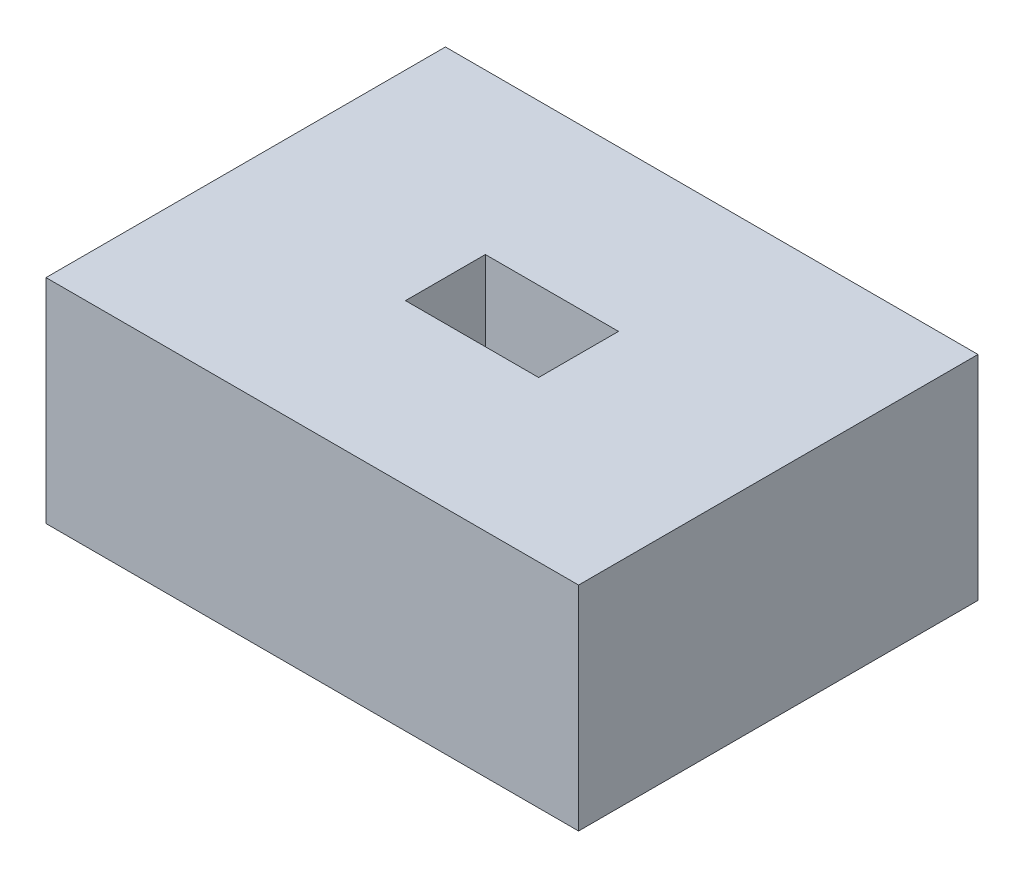
ISO-10303-21;
HEADER;
FILE_DESCRIPTION(('STEP AP214'),'2;1');
FILE_NAME('part.step','',(''),(''),'','','');
FILE_SCHEMA(('AUTOMOTIVE_DESIGN { 1 0 10303 214 1 1 1 1 }'));
ENDSEC;
DATA;
#1=APPLICATION_CONTEXT('core data for automotive mechanical design processes');
#2=APPLICATION_PROTOCOL_DEFINITION('international standard','automotive_design',2000,#1);
#3=PRODUCT_CONTEXT('',#1,'mechanical');
#4=PRODUCT('Part','Part','',(#3));
#5=PRODUCT_RELATED_PRODUCT_CATEGORY('part','',(#4));
#6=PRODUCT_DEFINITION_FORMATION('','',#4);
#7=PRODUCT_DEFINITION_CONTEXT('part definition',#1,'design');
#8=PRODUCT_DEFINITION('design','',#6,#7);
#9=PRODUCT_DEFINITION_SHAPE('','',#8);
#10=(LENGTH_UNIT() NAMED_UNIT(*) SI_UNIT(.MILLI.,.METRE.));
#11=(NAMED_UNIT(*) PLANE_ANGLE_UNIT() SI_UNIT($,.RADIAN.));
#12=(NAMED_UNIT(*) SI_UNIT($,.STERADIAN.) SOLID_ANGLE_UNIT());
#13=UNCERTAINTY_MEASURE_WITH_UNIT(LENGTH_MEASURE(1.E-05),#10,'distance_accuracy_value','');
#14=(GEOMETRIC_REPRESENTATION_CONTEXT(3) GLOBAL_UNCERTAINTY_ASSIGNED_CONTEXT((#13)) GLOBAL_UNIT_ASSIGNED_CONTEXT((#10,
#11,#12)) REPRESENTATION_CONTEXT('',''));
#15=CARTESIAN_POINT('',(0.,0.,0.));
#16=DIRECTION('',(0.,0.,1.));
#17=DIRECTION('',(1.,0.,0.));
#18=AXIS2_PLACEMENT_3D('',#15,#16,#17);
#19=CARTESIAN_POINT('',(10.,8.,7.5));
#20=DIRECTION('',(-1.,0.,0.));
#21=DIRECTION('',(0.,0.,1.));
#22=AXIS2_PLACEMENT_3D('',#19,#20,#21);
#23=PLANE('',#22);
#24=DIRECTION('',(0.,0.,-1.));
#25=VECTOR('',#24,1.);
#26=CARTESIAN_POINT('',(10.,0.,7.5));
#27=LINE('',#26,#25);
#28=CARTESIAN_POINT('',(10.,0.,7.5));
#29=VERTEX_POINT('',#28);
#30=CARTESIAN_POINT('',(10.,0.,-7.5));
#31=VERTEX_POINT('',#30);
#32=EDGE_CURVE('E172',#29,#31,#27,.T.);
#33=ORIENTED_EDGE('',*,*,#32,.T.);
#34=DIRECTION('',(0.,-1.,0.));
#35=VECTOR('',#34,1.);
#36=CARTESIAN_POINT('',(10.,8.,-7.5));
#37=LINE('',#36,#35);
#38=CARTESIAN_POINT('',(10.,8.,-7.5));
#39=VERTEX_POINT('',#38);
#40=EDGE_CURVE('E11',#39,#31,#37,.T.);
#41=ORIENTED_EDGE('',*,*,#40,.F.);
#42=DIRECTION('',(0.,0.,-1.));
#43=VECTOR('',#42,1.);
#44=CARTESIAN_POINT('',(10.,8.,7.5));
#45=LINE('',#44,#43);
#46=CARTESIAN_POINT('',(10.,8.,7.5));
#47=VERTEX_POINT('',#46);
#48=EDGE_CURVE('E179',#47,#39,#45,.T.);
#49=ORIENTED_EDGE('',*,*,#48,.F.);
#50=DIRECTION('',(0.,-1.,0.));
#51=VECTOR('',#50,1.);
#52=CARTESIAN_POINT('',(10.,8.,7.5));
#53=LINE('',#52,#51);
#54=EDGE_CURVE('E189',#47,#29,#53,.T.);
#55=ORIENTED_EDGE('',*,*,#54,.T.);
#56=EDGE_LOOP('',(#33,#41,#49,#55));
#57=FACE_BOUND('',#56,.T.);
#58=ADVANCED_FACE('F33',(#57),#23,.F.);
#59=CARTESIAN_POINT('',(-10.,8.,-7.5));
#60=DIRECTION('',(0.,0.,1.));
#61=DIRECTION('',(1.,0.,0.));
#62=AXIS2_PLACEMENT_3D('',#59,#60,#61);
#63=PLANE('',#62);
#64=DIRECTION('',(-1.,0.,0.));
#65=VECTOR('',#64,1.);
#66=CARTESIAN_POINT('',(-10.,0.,-7.5));
#67=LINE('',#66,#65);
#68=CARTESIAN_POINT('',(-10.,0.,-7.5));
#69=VERTEX_POINT('',#68);
#70=EDGE_CURVE('E192',#31,#69,#67,.T.);
#71=ORIENTED_EDGE('',*,*,#70,.T.);
#72=DIRECTION('',(0.,-1.,0.));
#73=VECTOR('',#72,1.);
#74=CARTESIAN_POINT('',(-10.,8.,-7.5));
#75=LINE('',#74,#73);
#76=CARTESIAN_POINT('',(-10.,8.,-7.5));
#77=VERTEX_POINT('',#76);
#78=EDGE_CURVE('E40',#77,#69,#75,.T.);
#79=ORIENTED_EDGE('',*,*,#78,.F.);
#80=DIRECTION('',(-1.,0.,0.));
#81=VECTOR('',#80,1.);
#82=CARTESIAN_POINT('',(-10.,8.,-7.5));
#83=LINE('',#82,#81);
#84=EDGE_CURVE('E182',#39,#77,#83,.T.);
#85=ORIENTED_EDGE('',*,*,#84,.F.);
#86=ORIENTED_EDGE('',*,*,#40,.T.);
#87=EDGE_LOOP('',(#71,#79,#85,#86));
#88=FACE_BOUND('',#87,.T.);
#89=ADVANCED_FACE('F222',(#88),#63,.F.);
#90=CARTESIAN_POINT('',(-10.,8.,7.5));
#91=DIRECTION('',(1.,0.,0.));
#92=DIRECTION('',(0.,0.,-1.));
#93=AXIS2_PLACEMENT_3D('',#90,#91,#92);
#94=PLANE('',#93);
#95=DIRECTION('',(0.,0.,1.));
#96=VECTOR('',#95,1.);
#97=CARTESIAN_POINT('',(-10.,0.,7.5));
#98=LINE('',#97,#96);
#99=CARTESIAN_POINT('',(-10.,0.,7.5));
#100=VERTEX_POINT('',#99);
#101=EDGE_CURVE('E194',#69,#100,#98,.T.);
#102=ORIENTED_EDGE('',*,*,#101,.T.);
#103=DIRECTION('',(0.,-1.,0.));
#104=VECTOR('',#103,1.);
#105=CARTESIAN_POINT('',(-10.,8.,7.5));
#106=LINE('',#105,#104);
#107=CARTESIAN_POINT('',(-10.,8.,7.5));
#108=VERTEX_POINT('',#107);
#109=EDGE_CURVE('E199',#108,#100,#106,.T.);
#110=ORIENTED_EDGE('',*,*,#109,.F.);
#111=DIRECTION('',(0.,0.,1.));
#112=VECTOR('',#111,1.);
#113=CARTESIAN_POINT('',(-10.,8.,7.5));
#114=LINE('',#113,#112);
#115=EDGE_CURVE('E185',#77,#108,#114,.T.);
#116=ORIENTED_EDGE('',*,*,#115,.F.);
#117=ORIENTED_EDGE('',*,*,#78,.T.);
#118=EDGE_LOOP('',(#102,#110,#116,#117));
#119=FACE_BOUND('',#118,.T.);
#120=ADVANCED_FACE('F206',(#119),#94,.F.);
#121=CARTESIAN_POINT('',(-10.,8.,7.5));
#122=DIRECTION('',(0.,0.,-1.));
#123=DIRECTION('',(-1.,0.,0.));
#124=AXIS2_PLACEMENT_3D('',#121,#122,#123);
#125=PLANE('',#124);
#126=DIRECTION('',(1.,0.,0.));
#127=VECTOR('',#126,1.);
#128=CARTESIAN_POINT('',(-10.,0.,7.5));
#129=LINE('',#128,#127);
#130=EDGE_CURVE('E183',#100,#29,#129,.T.);
#131=ORIENTED_EDGE('',*,*,#130,.T.);
#132=ORIENTED_EDGE('',*,*,#54,.F.);
#133=DIRECTION('',(1.,0.,0.));
#134=VECTOR('',#133,1.);
#135=CARTESIAN_POINT('',(-10.,8.,7.5));
#136=LINE('',#135,#134);
#137=EDGE_CURVE('E187',#108,#47,#136,.T.);
#138=ORIENTED_EDGE('',*,*,#137,.F.);
#139=ORIENTED_EDGE('',*,*,#109,.T.);
#140=EDGE_LOOP('',(#131,#132,#138,#139));
#141=FACE_BOUND('',#140,.T.);
#142=ADVANCED_FACE('F215',(#141),#125,.F.);
#143=CARTESIAN_POINT('',(0.,8.,0.));
#144=DIRECTION('',(0.,-1.,0.));
#145=DIRECTION('',(0.,0.,-1.));
#146=AXIS2_PLACEMENT_3D('',#143,#144,#145);
#147=PLANE('',#146);
#148=DIRECTION('',(-1.,0.,0.));
#149=VECTOR('',#148,1.);
#150=CARTESIAN_POINT('',(-2.5,8.,-1.5));
#151=LINE('',#150,#149);
#152=CARTESIAN_POINT('',(2.5,8.,-1.5));
#153=VERTEX_POINT('',#152);
#154=CARTESIAN_POINT('',(-2.5,8.,-1.5));
#155=VERTEX_POINT('',#154);
#156=EDGE_CURVE('E143',#153,#155,#151,.T.);
#157=ORIENTED_EDGE('',*,*,#156,.F.);
#158=DIRECTION('',(0.,0.,-1.));
#159=VECTOR('',#158,1.);
#160=CARTESIAN_POINT('',(2.5,8.,1.5));
#161=LINE('',#160,#159);
#162=CARTESIAN_POINT('',(2.5,8.,1.5));
#163=VERTEX_POINT('',#162);
#164=EDGE_CURVE('E141',#163,#153,#161,.T.);
#165=ORIENTED_EDGE('',*,*,#164,.F.);
#166=DIRECTION('',(1.,0.,0.));
#167=VECTOR('',#166,1.);
#168=CARTESIAN_POINT('',(-2.5,8.,1.5));
#169=LINE('',#168,#167);
#170=CARTESIAN_POINT('',(-2.5,8.,1.5));
#171=VERTEX_POINT('',#170);
#172=EDGE_CURVE('E153',#171,#163,#169,.T.);
#173=ORIENTED_EDGE('',*,*,#172,.F.);
#174=DIRECTION('',(0.,0.,1.));
#175=VECTOR('',#174,1.);
#176=CARTESIAN_POINT('',(-2.5,8.,1.5));
#177=LINE('',#176,#175);
#178=EDGE_CURVE('E165',#155,#171,#177,.T.);
#179=ORIENTED_EDGE('',*,*,#178,.F.);
#180=EDGE_LOOP('',(#157,#165,#173,#179));
#181=FACE_BOUND('',#180,.T.);
#182=ORIENTED_EDGE('',*,*,#48,.T.);
#183=ORIENTED_EDGE('',*,*,#84,.T.);
#184=ORIENTED_EDGE('',*,*,#115,.T.);
#185=ORIENTED_EDGE('',*,*,#137,.T.);
#186=EDGE_LOOP('',(#182,#183,#184,#185));
#187=FACE_BOUND('',#186,.T.);
#188=ADVANCED_FACE('F221',(#181,#187),#147,.F.);
#189=CARTESIAN_POINT('',(0.,0.,0.));
#190=DIRECTION('',(0.,-1.,0.));
#191=DIRECTION('',(0.,0.,-1.));
#192=AXIS2_PLACEMENT_3D('',#189,#190,#191);
#193=PLANE('',#192);
#194=DIRECTION('',(-1.,0.,0.));
#195=VECTOR('',#194,1.);
#196=CARTESIAN_POINT('',(2.5,0.,1.5));
#197=LINE('',#196,#195);
#198=CARTESIAN_POINT('',(2.5,0.,1.5));
#199=VERTEX_POINT('',#198);
#200=CARTESIAN_POINT('',(-2.5,0.,1.5));
#201=VERTEX_POINT('',#200);
#202=EDGE_CURVE('E47',#199,#201,#197,.T.);
#203=ORIENTED_EDGE('',*,*,#202,.F.);
#204=DIRECTION('',(0.,0.,1.));
#205=VECTOR('',#204,1.);
#206=CARTESIAN_POINT('',(2.5,0.,-1.5));
#207=LINE('',#206,#205);
#208=CARTESIAN_POINT('',(2.5,0.,-1.5));
#209=VERTEX_POINT('',#208);
#210=EDGE_CURVE('E51',#209,#199,#207,.T.);
#211=ORIENTED_EDGE('',*,*,#210,.F.);
#212=DIRECTION('',(1.,0.,0.));
#213=VECTOR('',#212,1.);
#214=CARTESIAN_POINT('',(-2.5,0.,-1.5));
#215=LINE('',#214,#213);
#216=CARTESIAN_POINT('',(-2.5,0.,-1.5));
#217=VERTEX_POINT('',#216);
#218=EDGE_CURVE('E367',#217,#209,#215,.T.);
#219=ORIENTED_EDGE('',*,*,#218,.F.);
#220=DIRECTION('',(0.,0.,-1.));
#221=VECTOR('',#220,1.);
#222=CARTESIAN_POINT('',(-2.5,0.,1.5));
#223=LINE('',#222,#221);
#224=EDGE_CURVE('E373',#201,#217,#223,.T.);
#225=ORIENTED_EDGE('',*,*,#224,.F.);
#226=EDGE_LOOP('',(#203,#211,#219,#225));
#227=FACE_BOUND('',#226,.T.);
#228=ORIENTED_EDGE('',*,*,#32,.F.);
#229=ORIENTED_EDGE('',*,*,#130,.F.);
#230=ORIENTED_EDGE('',*,*,#101,.F.);
#231=ORIENTED_EDGE('',*,*,#70,.F.);
#232=EDGE_LOOP('',(#228,#229,#230,#231));
#233=FACE_BOUND('',#232,.T.);
#234=ADVANCED_FACE('F212',(#227,#233),#193,.T.);
#235=CARTESIAN_POINT('',(2.5,4.8,1.5));
#236=DIRECTION('',(1.,0.,0.));
#237=DIRECTION('',(0.,0.,-1.));
#238=AXIS2_PLACEMENT_3D('',#235,#236,#237);
#239=PLANE('',#238);
#240=ORIENTED_EDGE('',*,*,#164,.T.);
#241=DIRECTION('',(0.,1.,0.));
#242=VECTOR('',#241,1.);
#243=CARTESIAN_POINT('',(2.5,4.8,-1.5));
#244=LINE('',#243,#242);
#245=CARTESIAN_POINT('',(2.5,4.8,-1.5));
#246=VERTEX_POINT('',#245);
#247=EDGE_CURVE('E161',#246,#153,#244,.T.);
#248=ORIENTED_EDGE('',*,*,#247,.F.);
#249=DIRECTION('',(0.,0.,-1.));
#250=VECTOR('',#249,1.);
#251=CARTESIAN_POINT('',(2.5,4.8,1.5));
#252=LINE('',#251,#250);
#253=CARTESIAN_POINT('',(2.5,4.8,1.5));
#254=VERTEX_POINT('',#253);
#255=EDGE_CURVE('E149',#254,#246,#252,.T.);
#256=ORIENTED_EDGE('',*,*,#255,.F.);
#257=DIRECTION('',(0.,1.,0.));
#258=VECTOR('',#257,1.);
#259=CARTESIAN_POINT('',(2.5,4.8,1.5));
#260=LINE('',#259,#258);
#261=EDGE_CURVE('E170',#254,#163,#260,.T.);
#262=ORIENTED_EDGE('',*,*,#261,.T.);
#263=EDGE_LOOP('',(#240,#248,#256,#262));
#264=FACE_BOUND('',#263,.T.);
#265=ADVANCED_FACE('F234',(#264),#239,.F.);
#266=CARTESIAN_POINT('',(-2.5,4.8,1.5));
#267=DIRECTION('',(0.,0.,1.));
#268=DIRECTION('',(1.,0.,0.));
#269=AXIS2_PLACEMENT_3D('',#266,#267,#268);
#270=PLANE('',#269);
#271=ORIENTED_EDGE('',*,*,#172,.T.);
#272=ORIENTED_EDGE('',*,*,#261,.F.);
#273=DIRECTION('',(1.,0.,0.));
#274=VECTOR('',#273,1.);
#275=CARTESIAN_POINT('',(-2.5,4.8,1.5));
#276=LINE('',#275,#274);
#277=CARTESIAN_POINT('',(-2.5,4.8,1.5));
#278=VERTEX_POINT('',#277);
#279=EDGE_CURVE('E159',#278,#254,#276,.T.);
#280=ORIENTED_EDGE('',*,*,#279,.F.);
#281=DIRECTION('',(0.,1.,0.));
#282=VECTOR('',#281,1.);
#283=CARTESIAN_POINT('',(-2.5,4.8,1.5));
#284=LINE('',#283,#282);
#285=EDGE_CURVE('E173',#278,#171,#284,.T.);
#286=ORIENTED_EDGE('',*,*,#285,.T.);
#287=EDGE_LOOP('',(#271,#272,#280,#286));
#288=FACE_BOUND('',#287,.T.);
#289=ADVANCED_FACE('F240',(#288),#270,.F.);
#290=CARTESIAN_POINT('',(-2.5,4.8,1.5));
#291=DIRECTION('',(-1.,0.,0.));
#292=DIRECTION('',(0.,0.,1.));
#293=AXIS2_PLACEMENT_3D('',#290,#291,#292);
#294=PLANE('',#293);
#295=ORIENTED_EDGE('',*,*,#178,.T.);
#296=ORIENTED_EDGE('',*,*,#285,.F.);
#297=DIRECTION('',(0.,0.,1.));
#298=VECTOR('',#297,1.);
#299=CARTESIAN_POINT('',(-2.5,4.8,1.5));
#300=LINE('',#299,#298);
#301=CARTESIAN_POINT('',(-2.5,4.8,-1.5));
#302=VERTEX_POINT('',#301);
#303=EDGE_CURVE('E156',#302,#278,#300,.T.);
#304=ORIENTED_EDGE('',*,*,#303,.F.);
#305=DIRECTION('',(0.,1.,0.));
#306=VECTOR('',#305,1.);
#307=CARTESIAN_POINT('',(-2.5,4.8,-1.5));
#308=LINE('',#307,#306);
#309=EDGE_CURVE('E175',#302,#155,#308,.T.);
#310=ORIENTED_EDGE('',*,*,#309,.T.);
#311=EDGE_LOOP('',(#295,#296,#304,#310));
#312=FACE_BOUND('',#311,.T.);
#313=ADVANCED_FACE('F246',(#312),#294,.F.);
#314=CARTESIAN_POINT('',(-2.5,4.8,-1.5));
#315=DIRECTION('',(0.,0.,-1.));
#316=DIRECTION('',(-1.,0.,0.));
#317=AXIS2_PLACEMENT_3D('',#314,#315,#316);
#318=PLANE('',#317);
#319=ORIENTED_EDGE('',*,*,#156,.T.);
#320=ORIENTED_EDGE('',*,*,#309,.F.);
#321=DIRECTION('',(-1.,0.,0.));
#322=VECTOR('',#321,1.);
#323=CARTESIAN_POINT('',(-2.5,4.8,-1.5));
#324=LINE('',#323,#322);
#325=EDGE_CURVE('E152',#246,#302,#324,.T.);
#326=ORIENTED_EDGE('',*,*,#325,.F.);
#327=ORIENTED_EDGE('',*,*,#247,.T.);
#328=EDGE_LOOP('',(#319,#320,#326,#327));
#329=FACE_BOUND('',#328,.T.);
#330=ADVANCED_FACE('F242',(#329),#318,.F.);
#331=CARTESIAN_POINT('',(0.,4.8,0.));
#332=DIRECTION('',(0.,-1.,0.));
#333=DIRECTION('',(0.,0.,-1.));
#334=AXIS2_PLACEMENT_3D('',#331,#332,#333);
#335=PLANE('',#334);
#336=ORIENTED_EDGE('',*,*,#255,.T.);
#337=ORIENTED_EDGE('',*,*,#325,.T.);
#338=ORIENTED_EDGE('',*,*,#303,.T.);
#339=ORIENTED_EDGE('',*,*,#279,.T.);
#340=EDGE_LOOP('',(#336,#337,#338,#339));
#341=FACE_BOUND('',#340,.T.);
#342=ADVANCED_FACE('F245',(#341),#335,.F.);
#343=CARTESIAN_POINT('',(2.5,-3.,1.5));
#344=DIRECTION('',(0.,0.,-1.));
#345=DIRECTION('',(-1.,0.,0.));
#346=AXIS2_PLACEMENT_3D('',#343,#344,#345);
#347=PLANE('',#346);
#348=ORIENTED_EDGE('',*,*,#202,.T.);
#349=DIRECTION('',(0.,1.,0.));
#350=VECTOR('',#349,1.);
#351=CARTESIAN_POINT('',(-2.5,-3.,1.5));
#352=LINE('',#351,#350);
#353=CARTESIAN_POINT('',(-2.5,-3.,1.5));
#354=VERTEX_POINT('',#353);
#355=EDGE_CURVE('E124',#354,#201,#352,.T.);
#356=ORIENTED_EDGE('',*,*,#355,.F.);
#357=DIRECTION('',(-1.,0.,0.));
#358=VECTOR('',#357,1.);
#359=CARTESIAN_POINT('',(2.5,-3.,1.5));
#360=LINE('',#359,#358);
#361=CARTESIAN_POINT('',(2.5,-3.,1.5));
#362=VERTEX_POINT('',#361);
#363=EDGE_CURVE('E130',#362,#354,#360,.T.);
#364=ORIENTED_EDGE('',*,*,#363,.F.);
#365=DIRECTION('',(0.,1.,0.));
#366=VECTOR('',#365,1.);
#367=CARTESIAN_POINT('',(2.5,-3.,1.5));
#368=LINE('',#367,#366);
#369=EDGE_CURVE('E365',#362,#199,#368,.T.);
#370=ORIENTED_EDGE('',*,*,#369,.T.);
#371=EDGE_LOOP('',(#348,#356,#364,#370));
#372=FACE_BOUND('',#371,.T.);
#373=ADVANCED_FACE('F140',(#372),#347,.F.);
#374=CARTESIAN_POINT('',(-2.5,-3.,1.5));
#375=DIRECTION('',(1.,0.,0.));
#376=DIRECTION('',(0.,0.,-1.));
#377=AXIS2_PLACEMENT_3D('',#374,#375,#376);
#378=PLANE('',#377);
#379=ORIENTED_EDGE('',*,*,#224,.T.);
#380=DIRECTION('',(0.,1.,0.));
#381=VECTOR('',#380,1.);
#382=CARTESIAN_POINT('',(-2.5,-3.,-1.5));
#383=LINE('',#382,#381);
#384=CARTESIAN_POINT('',(-2.5,-3.,-1.5));
#385=VERTEX_POINT('',#384);
#386=EDGE_CURVE('E126',#385,#217,#383,.T.);
#387=ORIENTED_EDGE('',*,*,#386,.F.);
#388=DIRECTION('',(0.,0.,-1.));
#389=VECTOR('',#388,1.);
#390=CARTESIAN_POINT('',(-2.5,-3.,1.5));
#391=LINE('',#390,#389);
#392=EDGE_CURVE('E119',#354,#385,#391,.T.);
#393=ORIENTED_EDGE('',*,*,#392,.F.);
#394=ORIENTED_EDGE('',*,*,#355,.T.);
#395=EDGE_LOOP('',(#379,#387,#393,#394));
#396=FACE_BOUND('',#395,.T.);
#397=ADVANCED_FACE('F122',(#396),#378,.F.);
#398=CARTESIAN_POINT('',(-2.5,-3.,-1.5));
#399=DIRECTION('',(0.,0.,1.));
#400=DIRECTION('',(1.,0.,0.));
#401=AXIS2_PLACEMENT_3D('',#398,#399,#400);
#402=PLANE('',#401);
#403=ORIENTED_EDGE('',*,*,#218,.T.);
#404=DIRECTION('',(0.,1.,0.));
#405=VECTOR('',#404,1.);
#406=CARTESIAN_POINT('',(2.5,-3.,-1.5));
#407=LINE('',#406,#405);
#408=CARTESIAN_POINT('',(2.5,-3.,-1.5));
#409=VERTEX_POINT('',#408);
#410=EDGE_CURVE('E145',#409,#209,#407,.T.);
#411=ORIENTED_EDGE('',*,*,#410,.F.);
#412=DIRECTION('',(1.,0.,0.));
#413=VECTOR('',#412,1.);
#414=CARTESIAN_POINT('',(-2.5,-3.,-1.5));
#415=LINE('',#414,#413);
#416=EDGE_CURVE('E129',#385,#409,#415,.T.);
#417=ORIENTED_EDGE('',*,*,#416,.F.);
#418=ORIENTED_EDGE('',*,*,#386,.T.);
#419=EDGE_LOOP('',(#403,#411,#417,#418));
#420=FACE_BOUND('',#419,.T.);
#421=ADVANCED_FACE('F261',(#420),#402,.F.);
#422=CARTESIAN_POINT('',(2.5,-3.,-1.5));
#423=DIRECTION('',(-1.,0.,0.));
#424=DIRECTION('',(0.,0.,1.));
#425=AXIS2_PLACEMENT_3D('',#422,#423,#424);
#426=PLANE('',#425);
#427=ORIENTED_EDGE('',*,*,#210,.T.);
#428=ORIENTED_EDGE('',*,*,#369,.F.);
#429=DIRECTION('',(0.,0.,1.));
#430=VECTOR('',#429,1.);
#431=CARTESIAN_POINT('',(2.5,-3.,-1.5));
#432=LINE('',#431,#430);
#433=EDGE_CURVE('E135',#409,#362,#432,.T.);
#434=ORIENTED_EDGE('',*,*,#433,.F.);
#435=ORIENTED_EDGE('',*,*,#410,.T.);
#436=EDGE_LOOP('',(#427,#428,#434,#435));
#437=FACE_BOUND('',#436,.T.);
#438=ADVANCED_FACE('F264',(#437),#426,.F.);
#439=CARTESIAN_POINT('',(0.,-3.,0.));
#440=DIRECTION('',(0.,-1.,0.));
#441=DIRECTION('',(0.,0.,-1.));
#442=AXIS2_PLACEMENT_3D('',#439,#440,#441);
#443=PLANE('',#442);
#444=ORIENTED_EDGE('',*,*,#363,.T.);
#445=ORIENTED_EDGE('',*,*,#392,.T.);
#446=ORIENTED_EDGE('',*,*,#416,.T.);
#447=ORIENTED_EDGE('',*,*,#433,.T.);
#448=EDGE_LOOP('',(#444,#445,#446,#447));
#449=FACE_BOUND('',#448,.T.);
#450=ADVANCED_FACE('F133',(#449),#443,.T.);
#451=CLOSED_SHELL('',(#58,#89,#120,#142,#188,#234,#265,#289,#313,#330,#342,#373,#397,#421,#438,#450));
#452=MANIFOLD_SOLID_BREP('B2',#451);
#453=ADVANCED_BREP_SHAPE_REPRESENTATION('',(#18,#452),#14);
#454=SHAPE_DEFINITION_REPRESENTATION(#9,#453);
ENDSEC;
END-ISO-10303-21;
